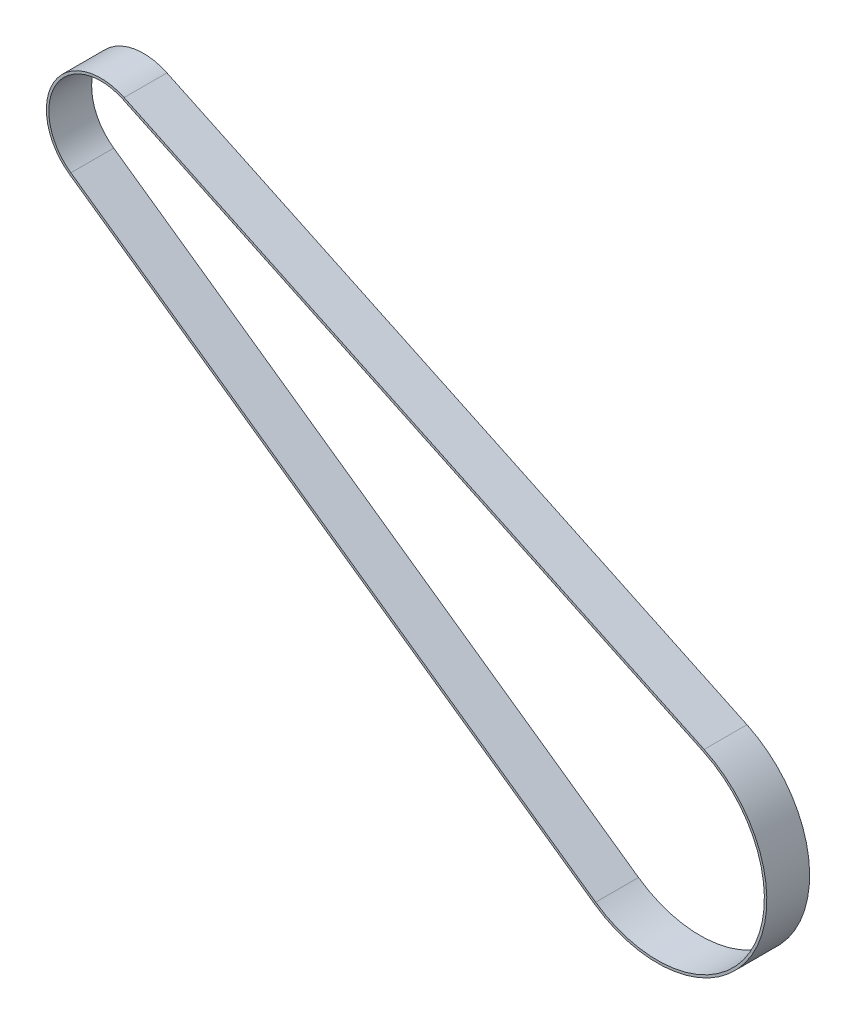
ISO-10303-21;
HEADER;
FILE_DESCRIPTION(('STEP AP214'),'2;1');
FILE_NAME('part.step','',(''),(''),'','','');
FILE_SCHEMA(('AUTOMOTIVE_DESIGN { 1 0 10303 214 1 1 1 1 }'));
ENDSEC;
DATA;
#1=APPLICATION_CONTEXT('core data for automotive mechanical design processes');
#2=APPLICATION_PROTOCOL_DEFINITION('international standard','automotive_design',2000,#1);
#3=PRODUCT_CONTEXT('',#1,'mechanical');
#4=PRODUCT('Part','Part','',(#3));
#5=PRODUCT_RELATED_PRODUCT_CATEGORY('part','',(#4));
#6=PRODUCT_DEFINITION_FORMATION('','',#4);
#7=PRODUCT_DEFINITION_CONTEXT('part definition',#1,'design');
#8=PRODUCT_DEFINITION('design','',#6,#7);
#9=PRODUCT_DEFINITION_SHAPE('','',#8);
#10=(LENGTH_UNIT() NAMED_UNIT(*) SI_UNIT(.MILLI.,.METRE.));
#11=(NAMED_UNIT(*) PLANE_ANGLE_UNIT() SI_UNIT($,.RADIAN.));
#12=(NAMED_UNIT(*) SI_UNIT($,.STERADIAN.) SOLID_ANGLE_UNIT());
#13=UNCERTAINTY_MEASURE_WITH_UNIT(LENGTH_MEASURE(1.E-05),#10,'distance_accuracy_value','');
#14=(GEOMETRIC_REPRESENTATION_CONTEXT(3) GLOBAL_UNCERTAINTY_ASSIGNED_CONTEXT((#13)) GLOBAL_UNIT_ASSIGNED_CONTEXT((#10,
#11,#12)) REPRESENTATION_CONTEXT('',''));
#15=CARTESIAN_POINT('',(0.,0.,0.));
#16=DIRECTION('',(0.,0.,1.));
#17=DIRECTION('',(1.,0.,0.));
#18=AXIS2_PLACEMENT_3D('',#15,#16,#17);
#19=CARTESIAN_POINT('',(577.57,0.,44.45));
#20=DIRECTION('',(0.,0.,1.));
#21=DIRECTION('',(1.,0.,0.));
#22=AXIS2_PLACEMENT_3D('',#19,#20,#21);
#23=PLANE('',#22);
#24=CARTESIAN_POINT('',(577.57,0.,44.45));
#25=DIRECTION('',(0.,0.,1.));
#26=DIRECTION('',(1.,0.,0.));
#27=AXIS2_PLACEMENT_3D('',#24,#25,#26);
#28=CIRCLE('',#27,113.665);
#29=CARTESIAN_POINT('',(512.157236509207,-92.9564553836781,44.45));
#30=VERTEX_POINT('',#29);
#31=CARTESIAN_POINT('',(626.190357384866,102.741389287706,44.45));
#32=VERTEX_POINT('',#31);
#33=EDGE_CURVE('E138',#30,#32,#28,.T.);
#34=ORIENTED_EDGE('',*,*,#33,.T.);
#35=DIRECTION('',(-0.903896443827965,0.42775135164621,0.));
#36=VECTOR('',#35,1.);
#37=CARTESIAN_POINT('',(626.190357384866,102.741389287706,44.45));
#38=LINE('',#37,#36);
#39=CARTESIAN_POINT('',(24.1743676382854,387.633707522937,44.45));
#40=VERTEX_POINT('',#39);
#41=EDGE_CURVE('E141',#32,#40,#38,.T.);
#42=ORIENTED_EDGE('',*,*,#41,.T.);
#43=CARTESIAN_POINT('',(0.,336.55,44.45));
#44=DIRECTION('',(0.,0.,1.));
#45=DIRECTION('',(1.,0.,0.));
#46=AXIS2_PLACEMENT_3D('',#43,#44,#45);
#47=CIRCLE('',#46,56.515);
#48=CARTESIAN_POINT('',(-32.5236645289413,290.331427211467,44.45));
#49=VERTEX_POINT('',#48);
#50=EDGE_CURVE('E144',#40,#49,#47,.T.);
#51=ORIENTED_EDGE('',*,*,#50,.T.);
#52=DIRECTION('',(0.817810719075158,-0.575487295920399,0.));
#53=VECTOR('',#52,1.);
#54=CARTESIAN_POINT('',(512.157236509207,-92.9564553836781,44.45));
#55=LINE('',#54,#53);
#56=EDGE_CURVE('E146',#49,#30,#55,.T.);
#57=ORIENTED_EDGE('',*,*,#56,.T.);
#58=EDGE_LOOP('',(#34,#42,#51,#57));
#59=FACE_BOUND('',#58,.T.);
#60=DIRECTION('',(-0.903896443827965,0.42775135164621,0.));
#61=VECTOR('',#60,1.);
#62=CARTESIAN_POINT('',(625.103868951685,100.445492320383,44.45));
#63=LINE('',#62,#61);
#64=CARTESIAN_POINT('',(625.103868951685,100.445492320383,44.45));
#65=VERTEX_POINT('',#64);
#66=CARTESIAN_POINT('',(23.0878792051042,385.337810555614,44.45));
#67=VERTEX_POINT('',#66);
#68=EDGE_CURVE('E108',#65,#67,#63,.T.);
#69=ORIENTED_EDGE('',*,*,#68,.F.);
#70=CARTESIAN_POINT('',(577.57,0.,44.45));
#71=DIRECTION('',(0.,0.,1.));
#72=DIRECTION('',(1.,0.,0.));
#73=AXIS2_PLACEMENT_3D('',#70,#71,#72);
#74=CIRCLE('',#73,111.125);
#75=CARTESIAN_POINT('',(513.618974240845,-90.8792161572271,44.45));
#76=VERTEX_POINT('',#75);
#77=EDGE_CURVE('E100',#76,#65,#74,.T.);
#78=ORIENTED_EDGE('',*,*,#77,.F.);
#79=DIRECTION('',(0.817810719075158,-0.575487295920399,0.));
#80=VECTOR('',#79,1.);
#81=CARTESIAN_POINT('',(513.618974240845,-90.8792161572271,44.45));
#82=LINE('',#81,#80);
#83=CARTESIAN_POINT('',(-31.0619267973035,292.408666437918,44.45));
#84=VERTEX_POINT('',#83);
#85=EDGE_CURVE('E122',#84,#76,#82,.T.);
#86=ORIENTED_EDGE('',*,*,#85,.F.);
#87=CARTESIAN_POINT('',(0.,336.55,44.45));
#88=DIRECTION('',(0.,0.,1.));
#89=DIRECTION('',(1.,0.,0.));
#90=AXIS2_PLACEMENT_3D('',#87,#88,#89);
#91=CIRCLE('',#90,53.975);
#92=EDGE_CURVE('E120',#67,#84,#91,.T.);
#93=ORIENTED_EDGE('',*,*,#92,.F.);
#94=EDGE_LOOP('',(#69,#78,#86,#93));
#95=FACE_BOUND('',#94,.T.);
#96=ADVANCED_FACE('F35',(#59,#95),#23,.T.);
#97=CARTESIAN_POINT('',(577.57,0.,0.));
#98=DIRECTION('',(0.,0.,1.));
#99=DIRECTION('',(1.,0.,0.));
#100=AXIS2_PLACEMENT_3D('',#97,#98,#99);
#101=PLANE('',#100);
#102=CARTESIAN_POINT('',(577.57,0.,0.));
#103=DIRECTION('',(0.,0.,1.));
#104=DIRECTION('',(1.,0.,0.));
#105=AXIS2_PLACEMENT_3D('',#102,#103,#104);
#106=CIRCLE('',#105,113.665);
#107=CARTESIAN_POINT('',(512.157236509207,-92.9564553836781,0.));
#108=VERTEX_POINT('',#107);
#109=CARTESIAN_POINT('',(626.190357384866,102.741389287706,0.));
#110=VERTEX_POINT('',#109);
#111=EDGE_CURVE('E116',#108,#110,#106,.T.);
#112=ORIENTED_EDGE('',*,*,#111,.F.);
#113=DIRECTION('',(0.817810719075158,-0.575487295920399,0.));
#114=VECTOR('',#113,1.);
#115=CARTESIAN_POINT('',(512.157236509207,-92.9564553836781,0.));
#116=LINE('',#115,#114);
#117=CARTESIAN_POINT('',(-32.5236645289413,290.331427211467,0.));
#118=VERTEX_POINT('',#117);
#119=EDGE_CURVE('E142',#118,#108,#116,.T.);
#120=ORIENTED_EDGE('',*,*,#119,.F.);
#121=CARTESIAN_POINT('',(0.,336.55,0.));
#122=DIRECTION('',(0.,0.,1.));
#123=DIRECTION('',(1.,0.,0.));
#124=AXIS2_PLACEMENT_3D('',#121,#122,#123);
#125=CIRCLE('',#124,56.515);
#126=CARTESIAN_POINT('',(24.1743676382854,387.633707522937,0.));
#127=VERTEX_POINT('',#126);
#128=EDGE_CURVE('E154',#127,#118,#125,.T.);
#129=ORIENTED_EDGE('',*,*,#128,.F.);
#130=DIRECTION('',(-0.903896443827965,0.42775135164621,0.));
#131=VECTOR('',#130,1.);
#132=CARTESIAN_POINT('',(626.190357384866,102.741389287706,0.));
#133=LINE('',#132,#131);
#134=EDGE_CURVE('E152',#110,#127,#133,.T.);
#135=ORIENTED_EDGE('',*,*,#134,.F.);
#136=EDGE_LOOP('',(#112,#120,#129,#135));
#137=FACE_BOUND('',#136,.T.);
#138=CARTESIAN_POINT('',(577.57,0.,0.));
#139=DIRECTION('',(0.,0.,1.));
#140=DIRECTION('',(1.,0.,0.));
#141=AXIS2_PLACEMENT_3D('',#138,#139,#140);
#142=CIRCLE('',#141,111.125);
#143=CARTESIAN_POINT('',(513.618974240845,-90.8792161572271,0.));
#144=VERTEX_POINT('',#143);
#145=CARTESIAN_POINT('',(625.103868951685,100.445492320383,0.));
#146=VERTEX_POINT('',#145);
#147=EDGE_CURVE('E58',#144,#146,#142,.T.);
#148=ORIENTED_EDGE('',*,*,#147,.T.);
#149=DIRECTION('',(-0.903896443827965,0.42775135164621,0.));
#150=VECTOR('',#149,1.);
#151=CARTESIAN_POINT('',(625.103868951685,100.445492320383,0.));
#152=LINE('',#151,#150);
#153=CARTESIAN_POINT('',(23.0878792051042,385.337810555614,0.));
#154=VERTEX_POINT('',#153);
#155=EDGE_CURVE('E115',#146,#154,#152,.T.);
#156=ORIENTED_EDGE('',*,*,#155,.T.);
#157=CARTESIAN_POINT('',(0.,336.55,0.));
#158=DIRECTION('',(0.,0.,1.));
#159=DIRECTION('',(1.,0.,0.));
#160=AXIS2_PLACEMENT_3D('',#157,#158,#159);
#161=CIRCLE('',#160,53.975);
#162=CARTESIAN_POINT('',(-31.0619267973035,292.408666437918,0.));
#163=VERTEX_POINT('',#162);
#164=EDGE_CURVE('E129',#154,#163,#161,.T.);
#165=ORIENTED_EDGE('',*,*,#164,.T.);
#166=DIRECTION('',(0.817810719075158,-0.575487295920399,0.));
#167=VECTOR('',#166,1.);
#168=CARTESIAN_POINT('',(513.618974240845,-90.8792161572271,0.));
#169=LINE('',#168,#167);
#170=EDGE_CURVE('E109',#163,#144,#169,.T.);
#171=ORIENTED_EDGE('',*,*,#170,.T.);
#172=EDGE_LOOP('',(#148,#156,#165,#171));
#173=FACE_BOUND('',#172,.T.);
#174=ADVANCED_FACE('F173',(#137,#173),#101,.F.);
#175=CARTESIAN_POINT('',(577.57,0.,44.45));
#176=DIRECTION('',(0.,0.,-1.));
#177=DIRECTION('',(-1.,0.,0.));
#178=AXIS2_PLACEMENT_3D('',#175,#176,#177);
#179=CYLINDRICAL_SURFACE('',#178,113.665);
#180=ORIENTED_EDGE('',*,*,#111,.T.);
#181=DIRECTION('',(0.,0.,-1.));
#182=VECTOR('',#181,1.);
#183=CARTESIAN_POINT('',(626.190357384866,102.741389287706,44.45));
#184=LINE('',#183,#182);
#185=EDGE_CURVE('E11',#32,#110,#184,.T.);
#186=ORIENTED_EDGE('',*,*,#185,.F.);
#187=ORIENTED_EDGE('',*,*,#33,.F.);
#188=DIRECTION('',(0.,0.,-1.));
#189=VECTOR('',#188,1.);
#190=CARTESIAN_POINT('',(512.157236509207,-92.9564553836781,44.45));
#191=LINE('',#190,#189);
#192=EDGE_CURVE('E149',#30,#108,#191,.T.);
#193=ORIENTED_EDGE('',*,*,#192,.T.);
#194=EDGE_LOOP('',(#180,#186,#187,#193));
#195=FACE_BOUND('',#194,.T.);
#196=ADVANCED_FACE('F37',(#195),#179,.T.);
#197=CARTESIAN_POINT('',(626.190357384866,102.741389287706,44.45));
#198=DIRECTION('',(-0.42775135164621,-0.903896443827964,0.));
#199=DIRECTION('',(0.903896443827964,-0.42775135164621,0.));
#200=AXIS2_PLACEMENT_3D('',#197,#198,#199);
#201=PLANE('',#200);
#202=ORIENTED_EDGE('',*,*,#134,.T.);
#203=DIRECTION('',(0.,0.,-1.));
#204=VECTOR('',#203,1.);
#205=CARTESIAN_POINT('',(24.1743676382854,387.633707522937,44.45));
#206=LINE('',#205,#204);
#207=EDGE_CURVE('E43',#40,#127,#206,.T.);
#208=ORIENTED_EDGE('',*,*,#207,.F.);
#209=ORIENTED_EDGE('',*,*,#41,.F.);
#210=ORIENTED_EDGE('',*,*,#185,.T.);
#211=EDGE_LOOP('',(#202,#208,#209,#210));
#212=FACE_BOUND('',#211,.T.);
#213=ADVANCED_FACE('F183',(#212),#201,.F.);
#214=CARTESIAN_POINT('',(0.,336.55,44.45));
#215=DIRECTION('',(0.,0.,-1.));
#216=DIRECTION('',(-1.,0.,0.));
#217=AXIS2_PLACEMENT_3D('',#214,#215,#216);
#218=CYLINDRICAL_SURFACE('',#217,56.515);
#219=ORIENTED_EDGE('',*,*,#128,.T.);
#220=DIRECTION('',(0.,0.,-1.));
#221=VECTOR('',#220,1.);
#222=CARTESIAN_POINT('',(-32.5236645289413,290.331427211467,44.45));
#223=LINE('',#222,#221);
#224=EDGE_CURVE('E160',#49,#118,#223,.T.);
#225=ORIENTED_EDGE('',*,*,#224,.F.);
#226=ORIENTED_EDGE('',*,*,#50,.F.);
#227=ORIENTED_EDGE('',*,*,#207,.T.);
#228=EDGE_LOOP('',(#219,#225,#226,#227));
#229=FACE_BOUND('',#228,.T.);
#230=ADVANCED_FACE('F167',(#229),#218,.T.);
#231=CARTESIAN_POINT('',(512.157236509207,-92.9564553836781,44.45));
#232=DIRECTION('',(0.575487295920399,0.817810719075158,0.));
#233=DIRECTION('',(-0.817810719075158,0.575487295920399,0.));
#234=AXIS2_PLACEMENT_3D('',#231,#232,#233);
#235=PLANE('',#234);
#236=ORIENTED_EDGE('',*,*,#119,.T.);
#237=ORIENTED_EDGE('',*,*,#192,.F.);
#238=ORIENTED_EDGE('',*,*,#56,.F.);
#239=ORIENTED_EDGE('',*,*,#224,.T.);
#240=EDGE_LOOP('',(#236,#237,#238,#239));
#241=FACE_BOUND('',#240,.T.);
#242=ADVANCED_FACE('F177',(#241),#235,.F.);
#243=CARTESIAN_POINT('',(577.57,0.,44.45));
#244=DIRECTION('',(0.,0.,-1.));
#245=DIRECTION('',(-1.,0.,0.));
#246=AXIS2_PLACEMENT_3D('',#243,#244,#245);
#247=CYLINDRICAL_SURFACE('',#246,111.125);
#248=ORIENTED_EDGE('',*,*,#147,.F.);
#249=DIRECTION('',(0.,0.,-1.));
#250=VECTOR('',#249,1.);
#251=CARTESIAN_POINT('',(513.618974240845,-90.8792161572271,44.45));
#252=LINE('',#251,#250);
#253=EDGE_CURVE('E104',#76,#144,#252,.T.);
#254=ORIENTED_EDGE('',*,*,#253,.F.);
#255=ORIENTED_EDGE('',*,*,#77,.T.);
#256=DIRECTION('',(0.,0.,-1.));
#257=VECTOR('',#256,1.);
#258=CARTESIAN_POINT('',(625.103868951685,100.445492320383,44.45));
#259=LINE('',#258,#257);
#260=EDGE_CURVE('E103',#65,#146,#259,.T.);
#261=ORIENTED_EDGE('',*,*,#260,.T.);
#262=EDGE_LOOP('',(#248,#254,#255,#261));
#263=FACE_BOUND('',#262,.T.);
#264=ADVANCED_FACE('F102',(#263),#247,.F.);
#265=CARTESIAN_POINT('',(625.103868951685,100.445492320383,44.45));
#266=DIRECTION('',(-0.42775135164621,-0.903896443827964,0.));
#267=DIRECTION('',(0.903896443827964,-0.42775135164621,0.));
#268=AXIS2_PLACEMENT_3D('',#265,#266,#267);
#269=PLANE('',#268);
#270=ORIENTED_EDGE('',*,*,#155,.F.);
#271=ORIENTED_EDGE('',*,*,#260,.F.);
#272=ORIENTED_EDGE('',*,*,#68,.T.);
#273=DIRECTION('',(0.,0.,-1.));
#274=VECTOR('',#273,1.);
#275=CARTESIAN_POINT('',(23.0878792051042,385.337810555614,44.45));
#276=LINE('',#275,#274);
#277=EDGE_CURVE('E117',#67,#154,#276,.T.);
#278=ORIENTED_EDGE('',*,*,#277,.T.);
#279=EDGE_LOOP('',(#270,#271,#272,#278));
#280=FACE_BOUND('',#279,.T.);
#281=ADVANCED_FACE('F112',(#280),#269,.T.);
#282=CARTESIAN_POINT('',(0.,336.55,44.45));
#283=DIRECTION('',(0.,0.,-1.));
#284=DIRECTION('',(-1.,0.,0.));
#285=AXIS2_PLACEMENT_3D('',#282,#283,#284);
#286=CYLINDRICAL_SURFACE('',#285,53.975);
#287=ORIENTED_EDGE('',*,*,#164,.F.);
#288=ORIENTED_EDGE('',*,*,#277,.F.);
#289=ORIENTED_EDGE('',*,*,#92,.T.);
#290=DIRECTION('',(0.,0.,-1.));
#291=VECTOR('',#290,1.);
#292=CARTESIAN_POINT('',(-31.0619267973035,292.408666437918,44.45));
#293=LINE('',#292,#291);
#294=EDGE_CURVE('E50',#84,#163,#293,.T.);
#295=ORIENTED_EDGE('',*,*,#294,.T.);
#296=EDGE_LOOP('',(#287,#288,#289,#295));
#297=FACE_BOUND('',#296,.T.);
#298=ADVANCED_FACE('F206',(#297),#286,.F.);
#299=CARTESIAN_POINT('',(513.618974240845,-90.8792161572271,44.45));
#300=DIRECTION('',(0.575487295920399,0.817810719075158,0.));
#301=DIRECTION('',(-0.817810719075158,0.575487295920399,0.));
#302=AXIS2_PLACEMENT_3D('',#299,#300,#301);
#303=PLANE('',#302);
#304=ORIENTED_EDGE('',*,*,#170,.F.);
#305=ORIENTED_EDGE('',*,*,#294,.F.);
#306=ORIENTED_EDGE('',*,*,#85,.T.);
#307=ORIENTED_EDGE('',*,*,#253,.T.);
#308=EDGE_LOOP('',(#304,#305,#306,#307));
#309=FACE_BOUND('',#308,.T.);
#310=ADVANCED_FACE('F210',(#309),#303,.T.);
#311=CLOSED_SHELL('',(#96,#174,#196,#213,#230,#242,#264,#281,#298,#310));
#312=MANIFOLD_SOLID_BREP('B2',#311);
#313=ADVANCED_BREP_SHAPE_REPRESENTATION('',(#18,#312),#14);
#314=SHAPE_DEFINITION_REPRESENTATION(#9,#313);
ENDSEC;
END-ISO-10303-21;
